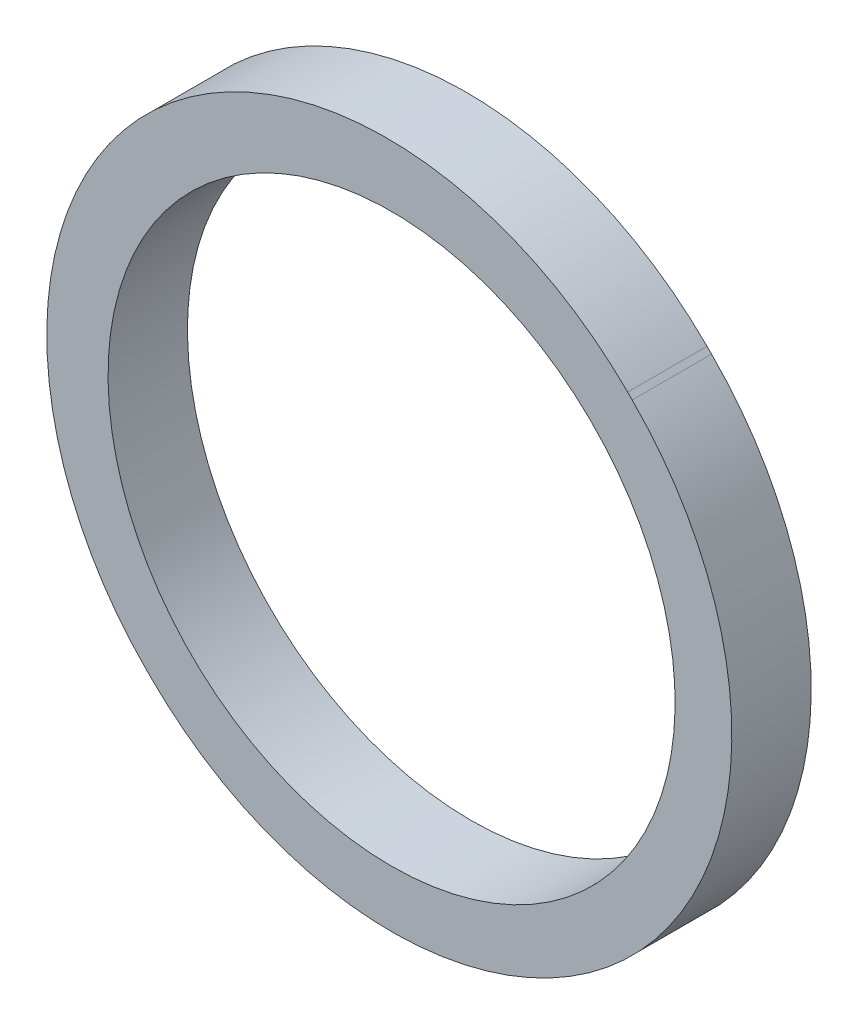
ISO-10303-21;
HEADER;
FILE_DESCRIPTION(('STEP AP214'),'2;1');
FILE_NAME('part.step','',(''),(''),'','','');
FILE_SCHEMA(('AUTOMOTIVE_DESIGN { 1 0 10303 214 1 1 1 1 }'));
ENDSEC;
DATA;
#1=APPLICATION_CONTEXT('core data for automotive mechanical design processes');
#2=APPLICATION_PROTOCOL_DEFINITION('international standard','automotive_design',2000,#1);
#3=PRODUCT_CONTEXT('',#1,'mechanical');
#4=PRODUCT('Part','Part','',(#3));
#5=PRODUCT_RELATED_PRODUCT_CATEGORY('part','',(#4));
#6=PRODUCT_DEFINITION_FORMATION('','',#4);
#7=PRODUCT_DEFINITION_CONTEXT('part definition',#1,'design');
#8=PRODUCT_DEFINITION('design','',#6,#7);
#9=PRODUCT_DEFINITION_SHAPE('','',#8);
#10=(LENGTH_UNIT() NAMED_UNIT(*) SI_UNIT(.MILLI.,.METRE.));
#11=(NAMED_UNIT(*) PLANE_ANGLE_UNIT() SI_UNIT($,.RADIAN.));
#12=(NAMED_UNIT(*) SI_UNIT($,.STERADIAN.) SOLID_ANGLE_UNIT());
#13=UNCERTAINTY_MEASURE_WITH_UNIT(LENGTH_MEASURE(1.E-05),#10,'distance_accuracy_value','');
#14=(GEOMETRIC_REPRESENTATION_CONTEXT(3) GLOBAL_UNCERTAINTY_ASSIGNED_CONTEXT((#13)) GLOBAL_UNIT_ASSIGNED_CONTEXT((#10,
#11,#12)) REPRESENTATION_CONTEXT('',''));
#15=CARTESIAN_POINT('',(0.,0.,0.));
#16=DIRECTION('',(0.,0.,1.));
#17=DIRECTION('',(1.,0.,0.));
#18=AXIS2_PLACEMENT_3D('',#15,#16,#17);
#19=CARTESIAN_POINT('',(132.67,-119.85,-0.045));
#20=DIRECTION('',(0.,0.,-1.));
#21=DIRECTION('',(0.,-1.,0.));
#22=AXIS2_PLACEMENT_3D('',#19,#20,#21);
#23=CYLINDRICAL_SURFACE('',#22,0.125);
#24=CARTESIAN_POINT('',(132.67,-119.85,1.6));
#25=DIRECTION('',(0.,0.,-1.));
#26=DIRECTION('',(0.,-1.,0.));
#27=AXIS2_PLACEMENT_3D('',#24,#25,#26);
#28=CIRCLE('',#27,0.125);
#29=CARTESIAN_POINT('',(132.67,-119.975,1.6));
#30=VERTEX_POINT('',#29);
#31=EDGE_CURVE('E126',#30,#30,#28,.T.);
#32=ORIENTED_EDGE('',*,*,#31,.T.);
#33=DIRECTION('',(0.,0.,1.));
#34=VECTOR('',#33,1.);
#35=CARTESIAN_POINT('',(132.67,-119.975,-0.045));
#36=LINE('',#35,#34);
#37=CARTESIAN_POINT('',(132.67,-119.975,1.635));
#38=VERTEX_POINT('',#37);
#39=EDGE_CURVE('E11',#30,#38,#36,.T.);
#40=ORIENTED_EDGE('',*,*,#39,.T.);
#41=CARTESIAN_POINT('',(132.67,-119.85,1.635));
#42=DIRECTION('',(0.,0.,-1.));
#43=DIRECTION('',(0.,-1.,0.));
#44=AXIS2_PLACEMENT_3D('',#41,#42,#43);
#45=CIRCLE('',#44,0.125);
#46=EDGE_CURVE('E26',#38,#38,#45,.T.);
#47=ORIENTED_EDGE('',*,*,#46,.F.);
#48=ORIENTED_EDGE('',*,*,#39,.F.);
#49=EDGE_LOOP('',(#32,#40,#47,#48));
#50=FACE_BOUND('',#49,.T.);
#51=ADVANCED_FACE('F17',(#50),#23,.F.);
#52=CARTESIAN_POINT('',(132.776066,-119.743933,1.6));
#53=DIRECTION('',(-0.707106781189048,-0.707106781184048,0.));
#54=DIRECTION('',(-0.707106781184048,0.707106781189048,0.));
#55=AXIS2_PLACEMENT_3D('',#52,#53,#54);
#56=PLANE('',#55);
#57=DIRECTION('',(-0.707106781184048,0.707106781189048,0.));
#58=VECTOR('',#57,1.);
#59=CARTESIAN_POINT('',(132.776066,-119.743933,1.6));
#60=LINE('',#59,#58);
#61=CARTESIAN_POINT('',(132.776066,-119.743933,1.6));
#62=VERTEX_POINT('',#61);
#63=CARTESIAN_POINT('',(132.774066,-119.741933,1.6));
#64=VERTEX_POINT('',#63);
#65=EDGE_CURVE('E132',#62,#64,#60,.T.);
#66=ORIENTED_EDGE('',*,*,#65,.T.);
#67=DIRECTION('',(0.,0.,1.));
#68=VECTOR('',#67,1.);
#69=CARTESIAN_POINT('',(132.774066,-119.741933,1.6));
#70=LINE('',#69,#68);
#71=CARTESIAN_POINT('',(132.774066,-119.741933,1.635));
#72=VERTEX_POINT('',#71);
#73=EDGE_CURVE('E84',#64,#72,#70,.T.);
#74=ORIENTED_EDGE('',*,*,#73,.T.);
#75=DIRECTION('',(-0.707106781184048,0.707106781189048,0.));
#76=VECTOR('',#75,1.);
#77=CARTESIAN_POINT('',(132.776066,-119.743933,1.635));
#78=LINE('',#77,#76);
#79=CARTESIAN_POINT('',(132.776066,-119.743933,1.635));
#80=VERTEX_POINT('',#79);
#81=EDGE_CURVE('E123',#80,#72,#78,.T.);
#82=ORIENTED_EDGE('',*,*,#81,.F.);
#83=DIRECTION('',(0.,0.,1.));
#84=VECTOR('',#83,1.);
#85=CARTESIAN_POINT('',(132.776066,-119.743933,1.6));
#86=LINE('',#85,#84);
#87=EDGE_CURVE('E112',#62,#80,#86,.T.);
#88=ORIENTED_EDGE('',*,*,#87,.F.);
#89=EDGE_LOOP('',(#66,#74,#82,#88));
#90=FACE_BOUND('',#89,.T.);
#91=ADVANCED_FACE('F19',(#90),#56,.F.);
#92=CARTESIAN_POINT('',(132.561933,-119.954066,1.635));
#93=DIRECTION('',(0.,0.,1.));
#94=DIRECTION('',(1.,0.,0.));
#95=AXIS2_PLACEMENT_3D('',#92,#93,#94);
#96=PLANE('',#95);
#97=ORIENTED_EDGE('',*,*,#46,.T.);
#98=EDGE_LOOP('',(#97));
#99=FACE_BOUND('',#98,.T.);
#100=DIRECTION('',(0.707106781181548,-0.707106781191548,0.));
#101=VECTOR('',#100,1.);
#102=CARTESIAN_POINT('',(132.561933,-119.954066,1.635));
#103=LINE('',#102,#101);
#104=CARTESIAN_POINT('',(132.561933,-119.954066,1.635));
#105=VERTEX_POINT('',#104);
#106=CARTESIAN_POINT('',(132.563933,-119.956066,1.635));
#107=VERTEX_POINT('',#106);
#108=EDGE_CURVE('E96',#105,#107,#103,.T.);
#109=ORIENTED_EDGE('',*,*,#108,.T.);
#110=CARTESIAN_POINT('',(132.6699995,-119.8499995,1.635));
#111=DIRECTION('',(0.,0.,1.));
#112=DIRECTION('',(-0.707106781186548,-0.707106781186548,0.));
#113=AXIS2_PLACEMENT_3D('',#110,#111,#112);
#114=CIRCLE('',#113,0.150000682813);
#115=EDGE_CURVE('E116',#107,#80,#114,.T.);
#116=ORIENTED_EDGE('',*,*,#115,.T.);
#117=ORIENTED_EDGE('',*,*,#81,.T.);
#118=CARTESIAN_POINT('',(132.6679995,-119.8479995,1.635));
#119=DIRECTION('',(0.,0.,1.));
#120=DIRECTION('',(0.707106781186548,0.707106781186548,0.));
#121=AXIS2_PLACEMENT_3D('',#118,#119,#120);
#122=CIRCLE('',#121,0.150000682813);
#123=EDGE_CURVE('E88',#72,#105,#122,.T.);
#124=ORIENTED_EDGE('',*,*,#123,.T.);
#125=EDGE_LOOP('',(#109,#116,#117,#124));
#126=FACE_BOUND('',#125,.T.);
#127=ADVANCED_FACE('F140',(#99,#126),#96,.T.);
#128=CARTESIAN_POINT('',(132.561933,-119.954066,1.6));
#129=DIRECTION('',(0.,0.,1.));
#130=DIRECTION('',(1.,0.,0.));
#131=AXIS2_PLACEMENT_3D('',#128,#129,#130);
#132=PLANE('',#131);
#133=ORIENTED_EDGE('',*,*,#31,.F.);
#134=EDGE_LOOP('',(#133));
#135=FACE_BOUND('',#134,.T.);
#136=CARTESIAN_POINT('',(132.6679995,-119.8479995,1.6));
#137=DIRECTION('',(0.,0.,1.));
#138=DIRECTION('',(0.707106781186548,0.707106781186548,0.));
#139=AXIS2_PLACEMENT_3D('',#136,#137,#138);
#140=CIRCLE('',#139,0.150000682813);
#141=CARTESIAN_POINT('',(132.561933,-119.954066,1.6));
#142=VERTEX_POINT('',#141);
#143=EDGE_CURVE('E77',#64,#142,#140,.T.);
#144=ORIENTED_EDGE('',*,*,#143,.F.);
#145=ORIENTED_EDGE('',*,*,#65,.F.);
#146=CARTESIAN_POINT('',(132.6699995,-119.8499995,1.6));
#147=DIRECTION('',(0.,0.,1.));
#148=DIRECTION('',(-0.707106781186548,-0.707106781186548,0.));
#149=AXIS2_PLACEMENT_3D('',#146,#147,#148);
#150=CIRCLE('',#149,0.150000682813);
#151=CARTESIAN_POINT('',(132.563933,-119.956066,1.6));
#152=VERTEX_POINT('',#151);
#153=EDGE_CURVE('E101',#152,#62,#150,.T.);
#154=ORIENTED_EDGE('',*,*,#153,.F.);
#155=DIRECTION('',(0.707106781181548,-0.707106781191548,0.));
#156=VECTOR('',#155,1.);
#157=CARTESIAN_POINT('',(132.561933,-119.954066,1.6));
#158=LINE('',#157,#156);
#159=EDGE_CURVE('E94',#142,#152,#158,.T.);
#160=ORIENTED_EDGE('',*,*,#159,.F.);
#161=EDGE_LOOP('',(#144,#145,#154,#160));
#162=FACE_BOUND('',#161,.T.);
#163=ADVANCED_FACE('F99',(#135,#162),#132,.F.);
#164=CARTESIAN_POINT('',(132.6699995,-119.8499995,1.6));
#165=DIRECTION('',(0.,0.,-1.));
#166=DIRECTION('',(-0.707106781186548,-0.707106781186548,0.));
#167=AXIS2_PLACEMENT_3D('',#164,#165,#166);
#168=CYLINDRICAL_SURFACE('',#167,0.150000682813);
#169=ORIENTED_EDGE('',*,*,#153,.T.);
#170=ORIENTED_EDGE('',*,*,#87,.T.);
#171=ORIENTED_EDGE('',*,*,#115,.F.);
#172=DIRECTION('',(0.,0.,1.));
#173=VECTOR('',#172,1.);
#174=CARTESIAN_POINT('',(132.563933,-119.956066,1.6));
#175=LINE('',#174,#173);
#176=EDGE_CURVE('E104',#152,#107,#175,.T.);
#177=ORIENTED_EDGE('',*,*,#176,.F.);
#178=EDGE_LOOP('',(#169,#170,#171,#177));
#179=FACE_BOUND('',#178,.T.);
#180=ADVANCED_FACE('F156',(#179),#168,.T.);
#181=CARTESIAN_POINT('',(132.6679995,-119.8479995,1.6));
#182=DIRECTION('',(0.,0.,-1.));
#183=DIRECTION('',(0.707106781186548,0.707106781186548,0.));
#184=AXIS2_PLACEMENT_3D('',#181,#182,#183);
#185=CYLINDRICAL_SURFACE('',#184,0.150000682813);
#186=ORIENTED_EDGE('',*,*,#143,.T.);
#187=DIRECTION('',(0.,0.,1.));
#188=VECTOR('',#187,1.);
#189=CARTESIAN_POINT('',(132.561933,-119.954066,1.6));
#190=LINE('',#189,#188);
#191=EDGE_CURVE('E81',#142,#105,#190,.T.);
#192=ORIENTED_EDGE('',*,*,#191,.T.);
#193=ORIENTED_EDGE('',*,*,#123,.F.);
#194=ORIENTED_EDGE('',*,*,#73,.F.);
#195=EDGE_LOOP('',(#186,#192,#193,#194));
#196=FACE_BOUND('',#195,.T.);
#197=ADVANCED_FACE('F79',(#196),#185,.T.);
#198=CARTESIAN_POINT('',(132.561933,-119.954066,1.6));
#199=DIRECTION('',(0.707106781191548,0.707106781181548,0.));
#200=DIRECTION('',(0.,0.,-1.));
#201=AXIS2_PLACEMENT_3D('',#198,#199,#200);
#202=PLANE('',#201);
#203=ORIENTED_EDGE('',*,*,#159,.T.);
#204=ORIENTED_EDGE('',*,*,#176,.T.);
#205=ORIENTED_EDGE('',*,*,#108,.F.);
#206=ORIENTED_EDGE('',*,*,#191,.F.);
#207=EDGE_LOOP('',(#203,#204,#205,#206));
#208=FACE_BOUND('',#207,.T.);
#209=ADVANCED_FACE('F92',(#208),#202,.F.);
#210=CLOSED_SHELL('',(#51,#91,#127,#163,#180,#197,#209));
#211=MANIFOLD_SOLID_BREP('B1',#210);
#212=ADVANCED_BREP_SHAPE_REPRESENTATION('',(#18,#211),#14);
#213=SHAPE_DEFINITION_REPRESENTATION(#9,#212);
ENDSEC;
END-ISO-10303-21;
